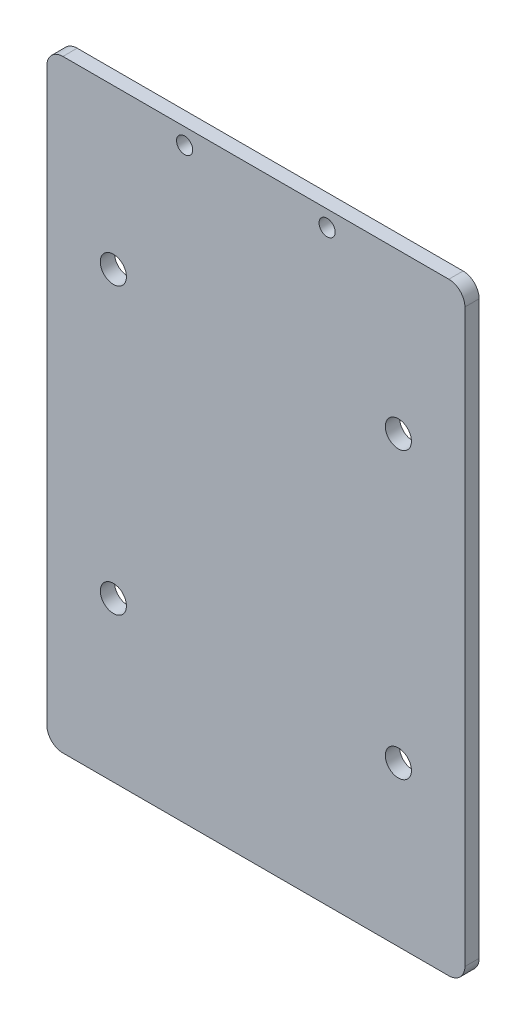
ISO-10303-21;
HEADER;
FILE_DESCRIPTION(('STEP AP214'),'2;1');
FILE_NAME('part.step','',(''),(''),'','','');
FILE_SCHEMA(('AUTOMOTIVE_DESIGN { 1 0 10303 214 1 1 1 1 }'));
ENDSEC;
DATA;
#1=APPLICATION_CONTEXT('core data for automotive mechanical design processes');
#2=APPLICATION_PROTOCOL_DEFINITION('international standard','automotive_design',2000,#1);
#3=PRODUCT_CONTEXT('',#1,'mechanical');
#4=PRODUCT('Part','Part','',(#3));
#5=PRODUCT_RELATED_PRODUCT_CATEGORY('part','',(#4));
#6=PRODUCT_DEFINITION_FORMATION('','',#4);
#7=PRODUCT_DEFINITION_CONTEXT('part definition',#1,'design');
#8=PRODUCT_DEFINITION('design','',#6,#7);
#9=PRODUCT_DEFINITION_SHAPE('','',#8);
#10=(LENGTH_UNIT() NAMED_UNIT(*) SI_UNIT(.MILLI.,.METRE.));
#11=(NAMED_UNIT(*) PLANE_ANGLE_UNIT() SI_UNIT($,.RADIAN.));
#12=(NAMED_UNIT(*) SI_UNIT($,.STERADIAN.) SOLID_ANGLE_UNIT());
#13=UNCERTAINTY_MEASURE_WITH_UNIT(LENGTH_MEASURE(1.E-05),#10,'distance_accuracy_value','');
#14=(GEOMETRIC_REPRESENTATION_CONTEXT(3) GLOBAL_UNCERTAINTY_ASSIGNED_CONTEXT((#13)) GLOBAL_UNIT_ASSIGNED_CONTEXT((#10,
#11,#12)) REPRESENTATION_CONTEXT('',''));
#15=CARTESIAN_POINT('',(0.,0.,0.));
#16=DIRECTION('',(0.,0.,1.));
#17=DIRECTION('',(1.,0.,0.));
#18=AXIS2_PLACEMENT_3D('',#15,#16,#17);
#19=CARTESIAN_POINT('',(40.62,-60.1199999999999,3.));
#20=DIRECTION('',(0.,0.,1.));
#21=DIRECTION('',(1.,0.,0.));
#22=AXIS2_PLACEMENT_3D('',#19,#20,#21);
#23=PLANE('',#22);
#24=CARTESIAN_POINT('',(14.9999999999999,60.1100000000003,3.));
#25=DIRECTION('',(0.,0.,1.));
#26=DIRECTION('',(1.,0.,0.));
#27=AXIS2_PLACEMENT_3D('',#24,#25,#26);
#28=CIRCLE('',#27,1.69999999999995);
#29=CARTESIAN_POINT('',(16.6999999999999,60.1100000000003,3.));
#30=VERTEX_POINT('',#29);
#31=EDGE_CURVE('E243',#30,#30,#28,.T.);
#32=ORIENTED_EDGE('',*,*,#31,.F.);
#33=EDGE_LOOP('',(#32));
#34=FACE_BOUND('',#33,.T.);
#35=CARTESIAN_POINT('',(-30.,-30.,3.));
#36=DIRECTION('',(0.,0.,1.));
#37=DIRECTION('',(1.,0.,0.));
#38=AXIS2_PLACEMENT_3D('',#35,#36,#37);
#39=CIRCLE('',#38,2.74999999999997);
#40=CARTESIAN_POINT('',(-27.25,-30.,3.));
#41=VERTEX_POINT('',#40);
#42=EDGE_CURVE('E227',#41,#41,#39,.T.);
#43=ORIENTED_EDGE('',*,*,#42,.F.);
#44=EDGE_LOOP('',(#43));
#45=FACE_BOUND('',#44,.T.);
#46=CARTESIAN_POINT('',(-30.0000000000002,30.,3.));
#47=DIRECTION('',(0.,0.,1.));
#48=DIRECTION('',(1.,0.,0.));
#49=AXIS2_PLACEMENT_3D('',#46,#47,#48);
#50=CIRCLE('',#49,2.74999999999997);
#51=CARTESIAN_POINT('',(-27.2500000000003,30.,3.));
#52=VERTEX_POINT('',#51);
#53=EDGE_CURVE('E152',#52,#52,#50,.T.);
#54=ORIENTED_EDGE('',*,*,#53,.F.);
#55=EDGE_LOOP('',(#54));
#56=FACE_BOUND('',#55,.T.);
#57=CARTESIAN_POINT('',(40.62,-60.1199999999999,3.));
#58=DIRECTION('',(0.,0.,1.));
#59=DIRECTION('',(1.,0.,0.));
#60=AXIS2_PLACEMENT_3D('',#57,#58,#59);
#61=CIRCLE('',#60,3.37999999999997);
#62=CARTESIAN_POINT('',(40.62,-63.4999999999999,3.));
#63=VERTEX_POINT('',#62);
#64=CARTESIAN_POINT('',(44.,-60.1199999999999,3.));
#65=VERTEX_POINT('',#64);
#66=EDGE_CURVE('E170',#63,#65,#61,.T.);
#67=ORIENTED_EDGE('',*,*,#66,.T.);
#68=DIRECTION('',(0.,1.,0.));
#69=VECTOR('',#68,1.);
#70=CARTESIAN_POINT('',(44.,-60.1199999999999,3.));
#71=LINE('',#70,#69);
#72=CARTESIAN_POINT('',(44.0000000000001,60.1199999999999,3.));
#73=VERTEX_POINT('',#72);
#74=EDGE_CURVE('E106',#65,#73,#71,.T.);
#75=ORIENTED_EDGE('',*,*,#74,.T.);
#76=CARTESIAN_POINT('',(40.62,60.1199999999999,3.));
#77=DIRECTION('',(0.,0.,1.));
#78=DIRECTION('',(1.,0.,0.));
#79=AXIS2_PLACEMENT_3D('',#76,#77,#78);
#80=CIRCLE('',#79,3.38000000000008);
#81=CARTESIAN_POINT('',(40.62,63.5000000000001,3.));
#82=VERTEX_POINT('',#81);
#83=EDGE_CURVE('E191',#73,#82,#80,.T.);
#84=ORIENTED_EDGE('',*,*,#83,.T.);
#85=DIRECTION('',(-1.,0.,0.));
#86=VECTOR('',#85,1.);
#87=CARTESIAN_POINT('',(40.62,63.5000000000001,3.));
#88=LINE('',#87,#86);
#89=CARTESIAN_POINT('',(-40.62,63.4999999999999,3.));
#90=VERTEX_POINT('',#89);
#91=EDGE_CURVE('E205',#82,#90,#88,.T.);
#92=ORIENTED_EDGE('',*,*,#91,.T.);
#93=CARTESIAN_POINT('',(-40.62,60.1199999999999,3.));
#94=DIRECTION('',(0.,0.,1.));
#95=DIRECTION('',(1.,0.,0.));
#96=AXIS2_PLACEMENT_3D('',#93,#94,#95);
#97=CIRCLE('',#96,3.37999999999997);
#98=CARTESIAN_POINT('',(-44.,60.1199999999999,3.));
#99=VERTEX_POINT('',#98);
#100=EDGE_CURVE('E125',#90,#99,#97,.T.);
#101=ORIENTED_EDGE('',*,*,#100,.T.);
#102=DIRECTION('',(0.,-1.,0.));
#103=VECTOR('',#102,1.);
#104=CARTESIAN_POINT('',(-44.,60.1199999999999,3.));
#105=LINE('',#104,#103);
#106=CARTESIAN_POINT('',(-44.0000000000001,-60.1199999999999,3.));
#107=VERTEX_POINT('',#106);
#108=EDGE_CURVE('E119',#99,#107,#105,.T.);
#109=ORIENTED_EDGE('',*,*,#108,.T.);
#110=CARTESIAN_POINT('',(-40.62,-60.1199999999999,3.));
#111=DIRECTION('',(0.,0.,1.));
#112=DIRECTION('',(1.,0.,0.));
#113=AXIS2_PLACEMENT_3D('',#110,#111,#112);
#114=CIRCLE('',#113,3.38000000000008);
#115=CARTESIAN_POINT('',(-40.62,-63.5000000000001,3.));
#116=VERTEX_POINT('',#115);
#117=EDGE_CURVE('E123',#107,#116,#114,.T.);
#118=ORIENTED_EDGE('',*,*,#117,.T.);
#119=DIRECTION('',(1.,0.,0.));
#120=VECTOR('',#119,1.);
#121=CARTESIAN_POINT('',(-40.62,-63.5000000000001,3.));
#122=LINE('',#121,#120);
#123=EDGE_CURVE('E63',#116,#63,#122,.T.);
#124=ORIENTED_EDGE('',*,*,#123,.T.);
#125=EDGE_LOOP('',(#67,#75,#84,#92,#101,#109,#118,#124));
#126=FACE_BOUND('',#125,.T.);
#127=CARTESIAN_POINT('',(30.,30.,3.));
#128=DIRECTION('',(0.,0.,1.));
#129=DIRECTION('',(1.,0.,0.));
#130=AXIS2_PLACEMENT_3D('',#127,#128,#129);
#131=CIRCLE('',#130,2.74999999999997);
#132=CARTESIAN_POINT('',(32.7499999999999,30.,3.));
#133=VERTEX_POINT('',#132);
#134=EDGE_CURVE('E219',#133,#133,#131,.T.);
#135=ORIENTED_EDGE('',*,*,#134,.F.);
#136=EDGE_LOOP('',(#135));
#137=FACE_BOUND('',#136,.T.);
#138=CARTESIAN_POINT('',(30.,-30.,3.));
#139=DIRECTION('',(0.,0.,1.));
#140=DIRECTION('',(1.,0.,0.));
#141=AXIS2_PLACEMENT_3D('',#138,#139,#140);
#142=CIRCLE('',#141,2.74999999999997);
#143=CARTESIAN_POINT('',(32.75,-30.,3.));
#144=VERTEX_POINT('',#143);
#145=EDGE_CURVE('E235',#144,#144,#142,.T.);
#146=ORIENTED_EDGE('',*,*,#145,.F.);
#147=EDGE_LOOP('',(#146));
#148=FACE_BOUND('',#147,.T.);
#149=CARTESIAN_POINT('',(-15.0000000000001,60.1100000000003,3.));
#150=DIRECTION('',(0.,0.,1.));
#151=DIRECTION('',(1.,0.,0.));
#152=AXIS2_PLACEMENT_3D('',#149,#150,#151);
#153=CIRCLE('',#152,1.69999999999995);
#154=CARTESIAN_POINT('',(-13.3000000000001,60.1100000000003,3.));
#155=VERTEX_POINT('',#154);
#156=EDGE_CURVE('E251',#155,#155,#153,.T.);
#157=ORIENTED_EDGE('',*,*,#156,.F.);
#158=EDGE_LOOP('',(#157));
#159=FACE_BOUND('',#158,.T.);
#160=ADVANCED_FACE('F45',(#34,#45,#56,#126,#137,#148,#159),#23,.T.);
#161=CARTESIAN_POINT('',(40.62,-60.1199999999999,0.));
#162=DIRECTION('',(0.,0.,1.));
#163=DIRECTION('',(1.,0.,0.));
#164=AXIS2_PLACEMENT_3D('',#161,#162,#163);
#165=PLANE('',#164);
#166=CARTESIAN_POINT('',(40.62,-60.1199999999999,0.));
#167=DIRECTION('',(0.,0.,1.));
#168=DIRECTION('',(1.,0.,0.));
#169=AXIS2_PLACEMENT_3D('',#166,#167,#168);
#170=CIRCLE('',#169,3.37999999999997);
#171=CARTESIAN_POINT('',(40.62,-63.4999999999999,0.));
#172=VERTEX_POINT('',#171);
#173=CARTESIAN_POINT('',(44.,-60.1199999999999,0.));
#174=VERTEX_POINT('',#173);
#175=EDGE_CURVE('E147',#172,#174,#170,.T.);
#176=ORIENTED_EDGE('',*,*,#175,.F.);
#177=DIRECTION('',(1.,0.,0.));
#178=VECTOR('',#177,1.);
#179=CARTESIAN_POINT('',(-40.62,-63.5000000000001,0.));
#180=LINE('',#179,#178);
#181=CARTESIAN_POINT('',(-40.62,-63.5000000000001,0.));
#182=VERTEX_POINT('',#181);
#183=EDGE_CURVE('E98',#182,#172,#180,.T.);
#184=ORIENTED_EDGE('',*,*,#183,.F.);
#185=CARTESIAN_POINT('',(-40.62,-60.1199999999999,0.));
#186=DIRECTION('',(0.,0.,1.));
#187=DIRECTION('',(1.,0.,0.));
#188=AXIS2_PLACEMENT_3D('',#185,#186,#187);
#189=CIRCLE('',#188,3.38000000000008);
#190=CARTESIAN_POINT('',(-44.0000000000001,-60.1199999999999,0.));
#191=VERTEX_POINT('',#190);
#192=EDGE_CURVE('E92',#191,#182,#189,.T.);
#193=ORIENTED_EDGE('',*,*,#192,.F.);
#194=DIRECTION('',(0.,-1.,0.));
#195=VECTOR('',#194,1.);
#196=CARTESIAN_POINT('',(-44.,60.1199999999999,0.));
#197=LINE('',#196,#195);
#198=CARTESIAN_POINT('',(-44.,60.1199999999999,0.));
#199=VERTEX_POINT('',#198);
#200=EDGE_CURVE('E134',#199,#191,#197,.T.);
#201=ORIENTED_EDGE('',*,*,#200,.F.);
#202=CARTESIAN_POINT('',(-40.62,60.1199999999999,0.));
#203=DIRECTION('',(0.,0.,1.));
#204=DIRECTION('',(1.,0.,0.));
#205=AXIS2_PLACEMENT_3D('',#202,#203,#204);
#206=CIRCLE('',#205,3.37999999999997);
#207=CARTESIAN_POINT('',(-40.62,63.4999999999999,0.));
#208=VERTEX_POINT('',#207);
#209=EDGE_CURVE('E161',#208,#199,#206,.T.);
#210=ORIENTED_EDGE('',*,*,#209,.F.);
#211=DIRECTION('',(-1.,0.,0.));
#212=VECTOR('',#211,1.);
#213=CARTESIAN_POINT('',(40.62,63.5000000000001,0.));
#214=LINE('',#213,#212);
#215=CARTESIAN_POINT('',(40.62,63.5000000000001,0.));
#216=VERTEX_POINT('',#215);
#217=EDGE_CURVE('E158',#216,#208,#214,.T.);
#218=ORIENTED_EDGE('',*,*,#217,.F.);
#219=CARTESIAN_POINT('',(40.62,60.1199999999999,0.));
#220=DIRECTION('',(0.,0.,1.));
#221=DIRECTION('',(1.,0.,0.));
#222=AXIS2_PLACEMENT_3D('',#219,#220,#221);
#223=CIRCLE('',#222,3.38000000000008);
#224=CARTESIAN_POINT('',(44.0000000000001,60.1199999999999,0.));
#225=VERTEX_POINT('',#224);
#226=EDGE_CURVE('E155',#225,#216,#223,.T.);
#227=ORIENTED_EDGE('',*,*,#226,.F.);
#228=DIRECTION('',(0.,1.,0.));
#229=VECTOR('',#228,1.);
#230=CARTESIAN_POINT('',(44.,-60.1199999999999,0.));
#231=LINE('',#230,#229);
#232=EDGE_CURVE('E151',#174,#225,#231,.T.);
#233=ORIENTED_EDGE('',*,*,#232,.F.);
#234=EDGE_LOOP('',(#176,#184,#193,#201,#210,#218,#227,#233));
#235=FACE_BOUND('',#234,.T.);
#236=CARTESIAN_POINT('',(-30.0000000000002,30.,0.));
#237=DIRECTION('',(0.,0.,1.));
#238=DIRECTION('',(1.,0.,0.));
#239=AXIS2_PLACEMENT_3D('',#236,#237,#238);
#240=CIRCLE('',#239,2.74999999999997);
#241=CARTESIAN_POINT('',(-27.2500000000003,30.,0.));
#242=VERTEX_POINT('',#241);
#243=EDGE_CURVE('E215',#242,#242,#240,.T.);
#244=ORIENTED_EDGE('',*,*,#243,.T.);
#245=EDGE_LOOP('',(#244));
#246=FACE_BOUND('',#245,.T.);
#247=CARTESIAN_POINT('',(30.,30.,0.));
#248=DIRECTION('',(0.,0.,1.));
#249=DIRECTION('',(1.,0.,0.));
#250=AXIS2_PLACEMENT_3D('',#247,#248,#249);
#251=CIRCLE('',#250,2.74999999999997);
#252=CARTESIAN_POINT('',(32.7499999999999,30.,0.));
#253=VERTEX_POINT('',#252);
#254=EDGE_CURVE('E223',#253,#253,#251,.T.);
#255=ORIENTED_EDGE('',*,*,#254,.T.);
#256=EDGE_LOOP('',(#255));
#257=FACE_BOUND('',#256,.T.);
#258=CARTESIAN_POINT('',(-30.,-30.,0.));
#259=DIRECTION('',(0.,0.,1.));
#260=DIRECTION('',(1.,0.,0.));
#261=AXIS2_PLACEMENT_3D('',#258,#259,#260);
#262=CIRCLE('',#261,2.74999999999997);
#263=CARTESIAN_POINT('',(-27.25,-30.,0.));
#264=VERTEX_POINT('',#263);
#265=EDGE_CURVE('E231',#264,#264,#262,.T.);
#266=ORIENTED_EDGE('',*,*,#265,.T.);
#267=EDGE_LOOP('',(#266));
#268=FACE_BOUND('',#267,.T.);
#269=CARTESIAN_POINT('',(30.,-30.,0.));
#270=DIRECTION('',(0.,0.,1.));
#271=DIRECTION('',(1.,0.,0.));
#272=AXIS2_PLACEMENT_3D('',#269,#270,#271);
#273=CIRCLE('',#272,2.74999999999997);
#274=CARTESIAN_POINT('',(32.75,-30.,0.));
#275=VERTEX_POINT('',#274);
#276=EDGE_CURVE('E239',#275,#275,#273,.T.);
#277=ORIENTED_EDGE('',*,*,#276,.T.);
#278=EDGE_LOOP('',(#277));
#279=FACE_BOUND('',#278,.T.);
#280=CARTESIAN_POINT('',(14.9999999999999,60.1100000000003,0.));
#281=DIRECTION('',(0.,0.,1.));
#282=DIRECTION('',(1.,0.,0.));
#283=AXIS2_PLACEMENT_3D('',#280,#281,#282);
#284=CIRCLE('',#283,1.69999999999995);
#285=CARTESIAN_POINT('',(16.6999999999999,60.1100000000003,0.));
#286=VERTEX_POINT('',#285);
#287=EDGE_CURVE('E247',#286,#286,#284,.T.);
#288=ORIENTED_EDGE('',*,*,#287,.T.);
#289=EDGE_LOOP('',(#288));
#290=FACE_BOUND('',#289,.T.);
#291=CARTESIAN_POINT('',(-15.0000000000001,60.1100000000003,0.));
#292=DIRECTION('',(0.,0.,1.));
#293=DIRECTION('',(1.,0.,0.));
#294=AXIS2_PLACEMENT_3D('',#291,#292,#293);
#295=CIRCLE('',#294,1.69999999999995);
#296=CARTESIAN_POINT('',(-13.3000000000001,60.1100000000003,0.));
#297=VERTEX_POINT('',#296);
#298=EDGE_CURVE('E255',#297,#297,#295,.T.);
#299=ORIENTED_EDGE('',*,*,#298,.T.);
#300=EDGE_LOOP('',(#299));
#301=FACE_BOUND('',#300,.T.);
#302=ADVANCED_FACE('F195',(#235,#246,#257,#268,#279,#290,#301),#165,.F.);
#303=CARTESIAN_POINT('',(40.62,-60.1199999999999,3.));
#304=DIRECTION('',(0.,0.,-1.));
#305=DIRECTION('',(-1.,0.,0.));
#306=AXIS2_PLACEMENT_3D('',#303,#304,#305);
#307=CYLINDRICAL_SURFACE('',#306,3.37999999999997);
#308=ORIENTED_EDGE('',*,*,#175,.T.);
#309=DIRECTION('',(0.,0.,-1.));
#310=VECTOR('',#309,1.);
#311=CARTESIAN_POINT('',(44.,-60.1199999999999,3.));
#312=LINE('',#311,#310);
#313=EDGE_CURVE('E11',#65,#174,#312,.T.);
#314=ORIENTED_EDGE('',*,*,#313,.F.);
#315=ORIENTED_EDGE('',*,*,#66,.F.);
#316=DIRECTION('',(0.,0.,-1.));
#317=VECTOR('',#316,1.);
#318=CARTESIAN_POINT('',(40.62,-63.4999999999999,3.));
#319=LINE('',#318,#317);
#320=EDGE_CURVE('E143',#63,#172,#319,.T.);
#321=ORIENTED_EDGE('',*,*,#320,.T.);
#322=EDGE_LOOP('',(#308,#314,#315,#321));
#323=FACE_BOUND('',#322,.T.);
#324=ADVANCED_FACE('F47',(#323),#307,.T.);
#325=CARTESIAN_POINT('',(44.,-60.1199999999999,3.));
#326=DIRECTION('',(-1.,0.,0.));
#327=DIRECTION('',(0.,-1.,0.));
#328=AXIS2_PLACEMENT_3D('',#325,#326,#327);
#329=PLANE('',#328);
#330=ORIENTED_EDGE('',*,*,#232,.T.);
#331=DIRECTION('',(0.,0.,-1.));
#332=VECTOR('',#331,1.);
#333=CARTESIAN_POINT('',(44.0000000000001,60.1199999999999,3.));
#334=LINE('',#333,#332);
#335=EDGE_CURVE('E55',#73,#225,#334,.T.);
#336=ORIENTED_EDGE('',*,*,#335,.F.);
#337=ORIENTED_EDGE('',*,*,#74,.F.);
#338=ORIENTED_EDGE('',*,*,#313,.T.);
#339=EDGE_LOOP('',(#330,#336,#337,#338));
#340=FACE_BOUND('',#339,.T.);
#341=ADVANCED_FACE('F291',(#340),#329,.F.);
#342=CARTESIAN_POINT('',(40.62,60.1199999999999,3.));
#343=DIRECTION('',(0.,0.,-1.));
#344=DIRECTION('',(-1.,0.,0.));
#345=AXIS2_PLACEMENT_3D('',#342,#343,#344);
#346=CYLINDRICAL_SURFACE('',#345,3.38000000000008);
#347=ORIENTED_EDGE('',*,*,#226,.T.);
#348=DIRECTION('',(0.,0.,-1.));
#349=VECTOR('',#348,1.);
#350=CARTESIAN_POINT('',(40.62,63.5000000000001,3.));
#351=LINE('',#350,#349);
#352=EDGE_CURVE('E181',#82,#216,#351,.T.);
#353=ORIENTED_EDGE('',*,*,#352,.F.);
#354=ORIENTED_EDGE('',*,*,#83,.F.);
#355=ORIENTED_EDGE('',*,*,#335,.T.);
#356=EDGE_LOOP('',(#347,#353,#354,#355));
#357=FACE_BOUND('',#356,.T.);
#358=ADVANCED_FACE('F189',(#357),#346,.T.);
#359=CARTESIAN_POINT('',(40.62,63.5000000000001,3.));
#360=DIRECTION('',(0.,-1.,0.));
#361=DIRECTION('',(1.,0.,0.));
#362=AXIS2_PLACEMENT_3D('',#359,#360,#361);
#363=PLANE('',#362);
#364=ORIENTED_EDGE('',*,*,#217,.T.);
#365=DIRECTION('',(0.,0.,-1.));
#366=VECTOR('',#365,1.);
#367=CARTESIAN_POINT('',(-40.62,63.4999999999999,3.));
#368=LINE('',#367,#366);
#369=EDGE_CURVE('E177',#90,#208,#368,.T.);
#370=ORIENTED_EDGE('',*,*,#369,.F.);
#371=ORIENTED_EDGE('',*,*,#91,.F.);
#372=ORIENTED_EDGE('',*,*,#352,.T.);
#373=EDGE_LOOP('',(#364,#370,#371,#372));
#374=FACE_BOUND('',#373,.T.);
#375=ADVANCED_FACE('F200',(#374),#363,.F.);
#376=CARTESIAN_POINT('',(-40.62,60.1199999999999,3.));
#377=DIRECTION('',(0.,0.,-1.));
#378=DIRECTION('',(-1.,0.,0.));
#379=AXIS2_PLACEMENT_3D('',#376,#377,#378);
#380=CYLINDRICAL_SURFACE('',#379,3.37999999999997);
#381=ORIENTED_EDGE('',*,*,#209,.T.);
#382=DIRECTION('',(0.,0.,-1.));
#383=VECTOR('',#382,1.);
#384=CARTESIAN_POINT('',(-44.,60.1199999999999,3.));
#385=LINE('',#384,#383);
#386=EDGE_CURVE('E136',#99,#199,#385,.T.);
#387=ORIENTED_EDGE('',*,*,#386,.F.);
#388=ORIENTED_EDGE('',*,*,#100,.F.);
#389=ORIENTED_EDGE('',*,*,#369,.T.);
#390=EDGE_LOOP('',(#381,#387,#388,#389));
#391=FACE_BOUND('',#390,.T.);
#392=ADVANCED_FACE('F203',(#391),#380,.T.);
#393=CARTESIAN_POINT('',(-44.,60.1199999999999,3.));
#394=DIRECTION('',(1.,0.,0.));
#395=DIRECTION('',(0.,1.,0.));
#396=AXIS2_PLACEMENT_3D('',#393,#394,#395);
#397=PLANE('',#396);
#398=ORIENTED_EDGE('',*,*,#200,.T.);
#399=DIRECTION('',(0.,0.,-1.));
#400=VECTOR('',#399,1.);
#401=CARTESIAN_POINT('',(-44.0000000000001,-60.1199999999999,3.));
#402=LINE('',#401,#400);
#403=EDGE_CURVE('E131',#107,#191,#402,.T.);
#404=ORIENTED_EDGE('',*,*,#403,.F.);
#405=ORIENTED_EDGE('',*,*,#108,.F.);
#406=ORIENTED_EDGE('',*,*,#386,.T.);
#407=EDGE_LOOP('',(#398,#404,#405,#406));
#408=FACE_BOUND('',#407,.T.);
#409=ADVANCED_FACE('F132',(#408),#397,.F.);
#410=CARTESIAN_POINT('',(-40.62,-60.1199999999999,3.));
#411=DIRECTION('',(0.,0.,-1.));
#412=DIRECTION('',(-1.,0.,0.));
#413=AXIS2_PLACEMENT_3D('',#410,#411,#412);
#414=CYLINDRICAL_SURFACE('',#413,3.38000000000008);
#415=ORIENTED_EDGE('',*,*,#192,.T.);
#416=DIRECTION('',(0.,0.,-1.));
#417=VECTOR('',#416,1.);
#418=CARTESIAN_POINT('',(-40.62,-63.5000000000001,3.));
#419=LINE('',#418,#417);
#420=EDGE_CURVE('E137',#116,#182,#419,.T.);
#421=ORIENTED_EDGE('',*,*,#420,.F.);
#422=ORIENTED_EDGE('',*,*,#117,.F.);
#423=ORIENTED_EDGE('',*,*,#403,.T.);
#424=EDGE_LOOP('',(#415,#421,#422,#423));
#425=FACE_BOUND('',#424,.T.);
#426=ADVANCED_FACE('F139',(#425),#414,.T.);
#427=CARTESIAN_POINT('',(-40.62,-63.5000000000001,3.));
#428=DIRECTION('',(0.,1.,0.));
#429=DIRECTION('',(-1.,0.,0.));
#430=AXIS2_PLACEMENT_3D('',#427,#428,#429);
#431=PLANE('',#430);
#432=ORIENTED_EDGE('',*,*,#183,.T.);
#433=ORIENTED_EDGE('',*,*,#320,.F.);
#434=ORIENTED_EDGE('',*,*,#123,.F.);
#435=ORIENTED_EDGE('',*,*,#420,.T.);
#436=EDGE_LOOP('',(#432,#433,#434,#435));
#437=FACE_BOUND('',#436,.T.);
#438=ADVANCED_FACE('F279',(#437),#431,.F.);
#439=CARTESIAN_POINT('',(-30.0000000000002,30.,3.));
#440=DIRECTION('',(0.,0.,-1.));
#441=DIRECTION('',(-1.,0.,0.));
#442=AXIS2_PLACEMENT_3D('',#439,#440,#441);
#443=CYLINDRICAL_SURFACE('',#442,2.74999999999997);
#444=ORIENTED_EDGE('',*,*,#53,.T.);
#445=EDGE_LOOP('',(#444));
#446=FACE_BOUND('',#445,.T.);
#447=ORIENTED_EDGE('',*,*,#243,.F.);
#448=EDGE_LOOP('',(#447));
#449=FACE_BOUND('',#448,.T.);
#450=ADVANCED_FACE('F276',(#446,#449),#443,.F.);
#451=CARTESIAN_POINT('',(30.,30.,3.));
#452=DIRECTION('',(0.,0.,-1.));
#453=DIRECTION('',(-1.,0.,0.));
#454=AXIS2_PLACEMENT_3D('',#451,#452,#453);
#455=CYLINDRICAL_SURFACE('',#454,2.74999999999997);
#456=ORIENTED_EDGE('',*,*,#134,.T.);
#457=EDGE_LOOP('',(#456));
#458=FACE_BOUND('',#457,.T.);
#459=ORIENTED_EDGE('',*,*,#254,.F.);
#460=EDGE_LOOP('',(#459));
#461=FACE_BOUND('',#460,.T.);
#462=ADVANCED_FACE('F354',(#458,#461),#455,.F.);
#463=CARTESIAN_POINT('',(-30.,-30.,3.));
#464=DIRECTION('',(0.,0.,-1.));
#465=DIRECTION('',(-1.,0.,0.));
#466=AXIS2_PLACEMENT_3D('',#463,#464,#465);
#467=CYLINDRICAL_SURFACE('',#466,2.74999999999997);
#468=ORIENTED_EDGE('',*,*,#42,.T.);
#469=EDGE_LOOP('',(#468));
#470=FACE_BOUND('',#469,.T.);
#471=ORIENTED_EDGE('',*,*,#265,.F.);
#472=EDGE_LOOP('',(#471));
#473=FACE_BOUND('',#472,.T.);
#474=ADVANCED_FACE('F362',(#470,#473),#467,.F.);
#475=CARTESIAN_POINT('',(30.,-30.,3.));
#476=DIRECTION('',(0.,0.,-1.));
#477=DIRECTION('',(-1.,0.,0.));
#478=AXIS2_PLACEMENT_3D('',#475,#476,#477);
#479=CYLINDRICAL_SURFACE('',#478,2.74999999999997);
#480=ORIENTED_EDGE('',*,*,#145,.T.);
#481=EDGE_LOOP('',(#480));
#482=FACE_BOUND('',#481,.T.);
#483=ORIENTED_EDGE('',*,*,#276,.F.);
#484=EDGE_LOOP('',(#483));
#485=FACE_BOUND('',#484,.T.);
#486=ADVANCED_FACE('F370',(#482,#485),#479,.F.);
#487=CARTESIAN_POINT('',(14.9999999999999,60.1100000000003,3.));
#488=DIRECTION('',(0.,0.,-1.));
#489=DIRECTION('',(-1.,0.,0.));
#490=AXIS2_PLACEMENT_3D('',#487,#488,#489);
#491=CYLINDRICAL_SURFACE('',#490,1.69999999999995);
#492=ORIENTED_EDGE('',*,*,#31,.T.);
#493=EDGE_LOOP('',(#492));
#494=FACE_BOUND('',#493,.T.);
#495=ORIENTED_EDGE('',*,*,#287,.F.);
#496=EDGE_LOOP('',(#495));
#497=FACE_BOUND('',#496,.T.);
#498=ADVANCED_FACE('F379',(#494,#497),#491,.F.);
#499=CARTESIAN_POINT('',(-15.0000000000001,60.1100000000003,3.));
#500=DIRECTION('',(0.,0.,-1.));
#501=DIRECTION('',(-1.,0.,0.));
#502=AXIS2_PLACEMENT_3D('',#499,#500,#501);
#503=CYLINDRICAL_SURFACE('',#502,1.69999999999995);
#504=ORIENTED_EDGE('',*,*,#156,.T.);
#505=EDGE_LOOP('',(#504));
#506=FACE_BOUND('',#505,.T.);
#507=ORIENTED_EDGE('',*,*,#298,.F.);
#508=EDGE_LOOP('',(#507));
#509=FACE_BOUND('',#508,.T.);
#510=ADVANCED_FACE('F263',(#506,#509),#503,.F.);
#511=CLOSED_SHELL('',(#160,#302,#324,#341,#358,#375,#392,#409,#426,#438,#450,#462,#474,#486,
#498,#510));
#512=MANIFOLD_SOLID_BREP('B2',#511);
#513=ADVANCED_BREP_SHAPE_REPRESENTATION('',(#18,#512),#14);
#514=SHAPE_DEFINITION_REPRESENTATION(#9,#513);
ENDSEC;
END-ISO-10303-21;
